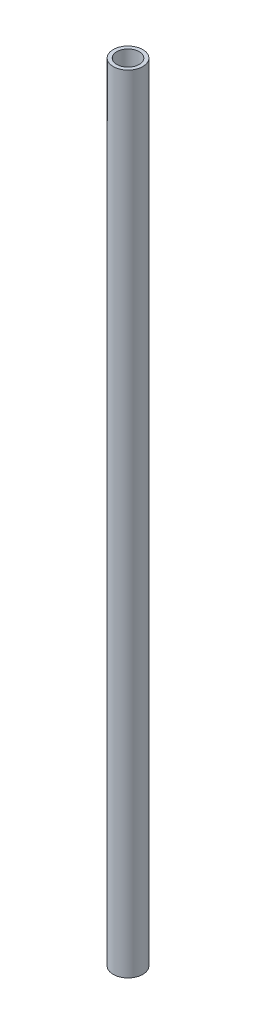
ISO-10303-21;
HEADER;
FILE_DESCRIPTION(('STEP AP214'),'2;1');
FILE_NAME('part.step','',(''),(''),'','','');
FILE_SCHEMA(('AUTOMOTIVE_DESIGN { 1 0 10303 214 1 1 1 1 }'));
ENDSEC;
DATA;
#1=APPLICATION_CONTEXT('core data for automotive mechanical design processes');
#2=APPLICATION_PROTOCOL_DEFINITION('international standard','automotive_design',2000,#1);
#3=PRODUCT_CONTEXT('',#1,'mechanical');
#4=PRODUCT('Part','Part','',(#3));
#5=PRODUCT_RELATED_PRODUCT_CATEGORY('part','',(#4));
#6=PRODUCT_DEFINITION_FORMATION('','',#4);
#7=PRODUCT_DEFINITION_CONTEXT('part definition',#1,'design');
#8=PRODUCT_DEFINITION('design','',#6,#7);
#9=PRODUCT_DEFINITION_SHAPE('','',#8);
#10=(LENGTH_UNIT() NAMED_UNIT(*) SI_UNIT(.MILLI.,.METRE.));
#11=(NAMED_UNIT(*) PLANE_ANGLE_UNIT() SI_UNIT($,.RADIAN.));
#12=(NAMED_UNIT(*) SI_UNIT($,.STERADIAN.) SOLID_ANGLE_UNIT());
#13=UNCERTAINTY_MEASURE_WITH_UNIT(LENGTH_MEASURE(1.E-05),#10,'distance_accuracy_value','');
#14=(GEOMETRIC_REPRESENTATION_CONTEXT(3) GLOBAL_UNCERTAINTY_ASSIGNED_CONTEXT((#13)) GLOBAL_UNIT_ASSIGNED_CONTEXT((#10,
#11,#12)) REPRESENTATION_CONTEXT('',''));
#15=CARTESIAN_POINT('',(0.,0.,0.));
#16=DIRECTION('',(0.,0.,1.));
#17=DIRECTION('',(1.,0.,0.));
#18=AXIS2_PLACEMENT_3D('',#15,#16,#17);
#19=CARTESIAN_POINT('',(0.,-130.9,0.));
#20=DIRECTION('',(0.,-1.,0.));
#21=DIRECTION('',(0.,0.,-1.));
#22=AXIS2_PLACEMENT_3D('',#19,#20,#21);
#23=CYLINDRICAL_SURFACE('',#22,1.25);
#24=CARTESIAN_POINT('',(0.,-126.9,0.));
#25=DIRECTION('',(0.,-1.,0.));
#26=DIRECTION('',(0.,0.,-1.));
#27=AXIS2_PLACEMENT_3D('',#24,#25,#26);
#28=CIRCLE('',#27,1.25);
#29=CARTESIAN_POINT('',(0.,-126.9,-1.25));
#30=VERTEX_POINT('',#29);
#31=EDGE_CURVE('E45',#30,#30,#28,.T.);
#32=ORIENTED_EDGE('',*,*,#31,.T.);
#33=EDGE_LOOP('',(#32));
#34=FACE_BOUND('',#33,.T.);
#35=CARTESIAN_POINT('',(0.,-39.,0.));
#36=DIRECTION('',(0.,-1.,0.));
#37=DIRECTION('',(0.,0.,-1.));
#38=AXIS2_PLACEMENT_3D('',#35,#36,#37);
#39=CIRCLE('',#38,1.25);
#40=CARTESIAN_POINT('',(0.,-39.,-1.25));
#41=VERTEX_POINT('',#40);
#42=EDGE_CURVE('E10',#41,#41,#39,.T.);
#43=ORIENTED_EDGE('',*,*,#42,.F.);
#44=EDGE_LOOP('',(#43));
#45=FACE_BOUND('',#44,.T.);
#46=ADVANCED_FACE('F31',(#34,#45),#23,.F.);
#47=CARTESIAN_POINT('',(1.25,-39.,0.));
#48=DIRECTION('',(0.,1.,0.));
#49=DIRECTION('',(0.,0.,1.));
#50=AXIS2_PLACEMENT_3D('',#47,#48,#49);
#51=PLANE('',#50);
#52=ORIENTED_EDGE('',*,*,#42,.T.);
#53=EDGE_LOOP('',(#52));
#54=FACE_BOUND('',#53,.T.);
#55=CARTESIAN_POINT('',(0.,-39.,0.));
#56=DIRECTION('',(0.,-1.,0.));
#57=DIRECTION('',(0.,0.,-1.));
#58=AXIS2_PLACEMENT_3D('',#55,#56,#57);
#59=CIRCLE('',#58,1.65);
#60=CARTESIAN_POINT('',(0.,-39.,-1.65));
#61=VERTEX_POINT('',#60);
#62=EDGE_CURVE('E37',#61,#61,#59,.T.);
#63=ORIENTED_EDGE('',*,*,#62,.F.);
#64=EDGE_LOOP('',(#63));
#65=FACE_BOUND('',#64,.T.);
#66=ADVANCED_FACE('F61',(#54,#65),#51,.T.);
#67=CARTESIAN_POINT('',(0.,-130.9,0.));
#68=DIRECTION('',(0.,-1.,0.));
#69=DIRECTION('',(0.,0.,-1.));
#70=AXIS2_PLACEMENT_3D('',#67,#68,#69);
#71=CYLINDRICAL_SURFACE('',#70,1.65);
#72=ORIENTED_EDGE('',*,*,#62,.T.);
#73=EDGE_LOOP('',(#72));
#74=FACE_BOUND('',#73,.T.);
#75=CARTESIAN_POINT('',(0.,-126.9,0.));
#76=DIRECTION('',(0.,-1.,0.));
#77=DIRECTION('',(0.,0.,-1.));
#78=AXIS2_PLACEMENT_3D('',#75,#76,#77);
#79=CIRCLE('',#78,1.65);
#80=CARTESIAN_POINT('',(0.,-126.9,-1.65));
#81=VERTEX_POINT('',#80);
#82=EDGE_CURVE('E41',#81,#81,#79,.T.);
#83=ORIENTED_EDGE('',*,*,#82,.F.);
#84=EDGE_LOOP('',(#83));
#85=FACE_BOUND('',#84,.T.);
#86=ADVANCED_FACE('F55',(#74,#85),#71,.T.);
#87=CARTESIAN_POINT('',(1.65,-126.9,0.));
#88=DIRECTION('',(0.,-1.,0.));
#89=DIRECTION('',(0.,0.,-1.));
#90=AXIS2_PLACEMENT_3D('',#87,#88,#89);
#91=PLANE('',#90);
#92=ORIENTED_EDGE('',*,*,#82,.T.);
#93=EDGE_LOOP('',(#92));
#94=FACE_BOUND('',#93,.T.);
#95=ORIENTED_EDGE('',*,*,#31,.F.);
#96=EDGE_LOOP('',(#95));
#97=FACE_BOUND('',#96,.T.);
#98=ADVANCED_FACE('F53',(#94,#97),#91,.T.);
#99=CLOSED_SHELL('',(#46,#66,#86,#98));
#100=MANIFOLD_SOLID_BREP('B2',#99);
#101=ADVANCED_BREP_SHAPE_REPRESENTATION('',(#18,#100),#14);
#102=SHAPE_DEFINITION_REPRESENTATION(#9,#101);
ENDSEC;
END-ISO-10303-21;
